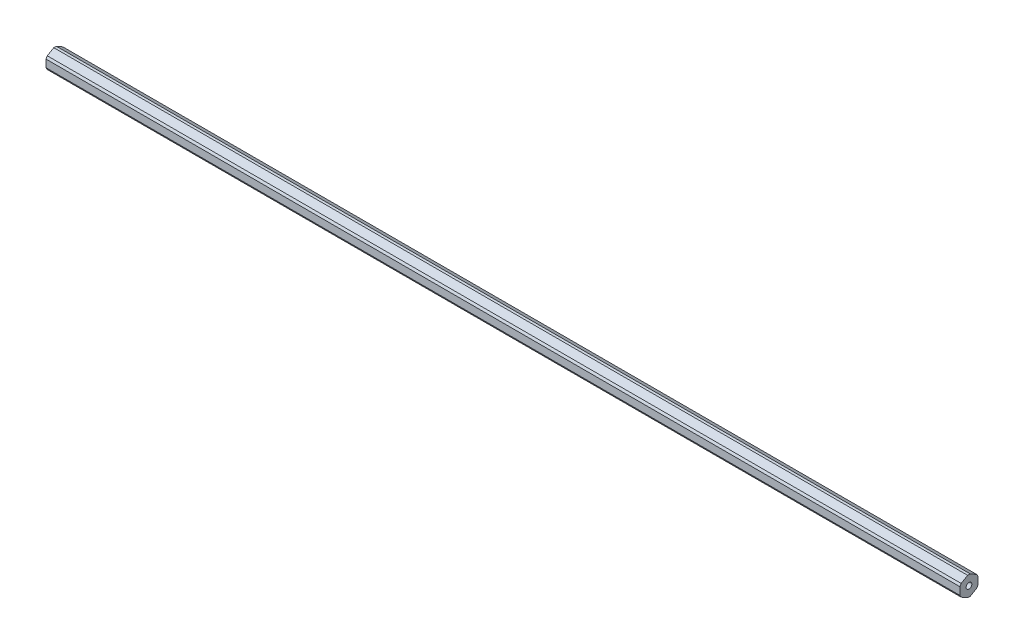
ISO-10303-21;
HEADER;
FILE_DESCRIPTION(('STEP AP214'),'2;1');
FILE_NAME('part.step','',(''),(''),'','','');
FILE_SCHEMA(('AUTOMOTIVE_DESIGN { 1 0 10303 214 1 1 1 1 }'));
ENDSEC;
DATA;
#1=APPLICATION_CONTEXT('core data for automotive mechanical design processes');
#2=APPLICATION_PROTOCOL_DEFINITION('international standard','automotive_design',2000,#1);
#3=PRODUCT_CONTEXT('',#1,'mechanical');
#4=PRODUCT('Part','Part','',(#3));
#5=PRODUCT_RELATED_PRODUCT_CATEGORY('part','',(#4));
#6=PRODUCT_DEFINITION_FORMATION('','',#4);
#7=PRODUCT_DEFINITION_CONTEXT('part definition',#1,'design');
#8=PRODUCT_DEFINITION('design','',#6,#7);
#9=PRODUCT_DEFINITION_SHAPE('','',#8);
#10=(LENGTH_UNIT() NAMED_UNIT(*) SI_UNIT(.MILLI.,.METRE.));
#11=(NAMED_UNIT(*) PLANE_ANGLE_UNIT() SI_UNIT($,.RADIAN.));
#12=(NAMED_UNIT(*) SI_UNIT($,.STERADIAN.) SOLID_ANGLE_UNIT());
#13=UNCERTAINTY_MEASURE_WITH_UNIT(LENGTH_MEASURE(1.E-05),#10,'distance_accuracy_value','');
#14=(GEOMETRIC_REPRESENTATION_CONTEXT(3) GLOBAL_UNCERTAINTY_ASSIGNED_CONTEXT((#13)) GLOBAL_UNIT_ASSIGNED_CONTEXT((#10,
#11,#12)) REPRESENTATION_CONTEXT('',''));
#15=CARTESIAN_POINT('',(0.,0.,0.));
#16=DIRECTION('',(0.,0.,1.));
#17=DIRECTION('',(1.,0.,0.));
#18=AXIS2_PLACEMENT_3D('',#15,#16,#17);
#19=CARTESIAN_POINT('',(320.675,60.3334399223982,544.710452363446));
#20=DIRECTION('',(0.,-0.866025403784439,-0.5));
#21=DIRECTION('',(0.,0.5,-0.866025403784439));
#22=AXIS2_PLACEMENT_3D('',#19,#20,#21);
#23=PLANE('',#22);
#24=DIRECTION('',(-1.,0.,0.));
#25=VECTOR('',#24,1.);
#26=CARTESIAN_POINT('',(320.675,61.6502711795929,542.42963372099));
#27=LINE('',#26,#25);
#28=CARTESIAN_POINT('',(320.675,61.6502711795929,542.42963372099));
#29=VERTEX_POINT('',#28);
#30=CARTESIAN_POINT('',(-320.675,61.6502711795931,542.42963372099));
#31=VERTEX_POINT('',#30);
#32=EDGE_CURVE('E183',#29,#31,#27,.T.);
#33=ORIENTED_EDGE('',*,*,#32,.T.);
#34=DIRECTION('',(0.,0.5,-0.866025403784438));
#35=VECTOR('',#34,1.);
#36=CARTESIAN_POINT('',(-320.675,60.3334399223984,544.710452363446));
#37=LINE('',#36,#35);
#38=CARTESIAN_POINT('',(-320.675,59.0166086652037,546.991271005902));
#39=VERTEX_POINT('',#38);
#40=EDGE_CURVE('E142',#39,#31,#37,.T.);
#41=ORIENTED_EDGE('',*,*,#40,.F.);
#42=DIRECTION('',(-1.,0.,0.));
#43=VECTOR('',#42,1.);
#44=CARTESIAN_POINT('',(320.675,59.0166086652036,546.991271005902));
#45=LINE('',#44,#43);
#46=CARTESIAN_POINT('',(320.675,59.0166086652036,546.991271005902));
#47=VERTEX_POINT('',#46);
#48=EDGE_CURVE('E186',#39,#47,#45,.F.);
#49=ORIENTED_EDGE('',*,*,#48,.T.);
#50=DIRECTION('',(0.,-0.5,0.866025403784439));
#51=VECTOR('',#50,1.);
#52=CARTESIAN_POINT('',(320.675,60.3334399223982,544.710452363446));
#53=LINE('',#52,#51);
#54=EDGE_CURVE('E194',#29,#47,#53,.T.);
#55=ORIENTED_EDGE('',*,*,#54,.F.);
#56=EDGE_LOOP('',(#33,#41,#49,#55));
#57=FACE_BOUND('',#56,.T.);
#58=ADVANCED_FACE('F17',(#57),#23,.F.);
#59=CARTESIAN_POINT('',(320.675,54.8337049223982,547.885725846167));
#60=DIRECTION('',(0.,0.,-1.));
#61=DIRECTION('',(-1.,0.,0.));
#62=AXIS2_PLACEMENT_3D('',#59,#60,#61);
#63=PLANE('',#62);
#64=DIRECTION('',(-1.,0.,0.));
#65=VECTOR('',#64,1.);
#66=CARTESIAN_POINT('',(320.675,57.4673674367876,547.885725846167));
#67=LINE('',#66,#65);
#68=CARTESIAN_POINT('',(320.675,57.4673674367876,547.885725846167));
#69=VERTEX_POINT('',#68);
#70=CARTESIAN_POINT('',(-320.675,57.4673674367878,547.885725846167));
#71=VERTEX_POINT('',#70);
#72=EDGE_CURVE('E118',#69,#71,#67,.T.);
#73=ORIENTED_EDGE('',*,*,#72,.T.);
#74=DIRECTION('',(0.,1.,0.));
#75=VECTOR('',#74,1.);
#76=CARTESIAN_POINT('',(-320.675,54.8337049223984,547.885725846167));
#77=LINE('',#76,#75);
#78=CARTESIAN_POINT('',(-320.675,52.200042408009,547.885725846167));
#79=VERTEX_POINT('',#78);
#80=EDGE_CURVE('E136',#79,#71,#77,.T.);
#81=ORIENTED_EDGE('',*,*,#80,.F.);
#82=DIRECTION('',(-1.,0.,0.));
#83=VECTOR('',#82,1.);
#84=CARTESIAN_POINT('',(320.675,52.2000424080089,547.885725846167));
#85=LINE('',#84,#83);
#86=CARTESIAN_POINT('',(320.675,52.2000424080089,547.885725846167));
#87=VERTEX_POINT('',#86);
#88=EDGE_CURVE('E179',#79,#87,#85,.F.);
#89=ORIENTED_EDGE('',*,*,#88,.T.);
#90=DIRECTION('',(0.,-1.,0.));
#91=VECTOR('',#90,1.);
#92=CARTESIAN_POINT('',(320.675,54.8337049223982,547.885725846167));
#93=LINE('',#92,#91);
#94=EDGE_CURVE('E198',#69,#87,#93,.T.);
#95=ORIENTED_EDGE('',*,*,#94,.F.);
#96=EDGE_LOOP('',(#73,#81,#89,#95));
#97=FACE_BOUND('',#96,.T.);
#98=ADVANCED_FACE('F253',(#97),#63,.F.);
#99=CARTESIAN_POINT('',(320.675,49.3339699223982,544.710452363446));
#100=DIRECTION('',(0.,0.866025403784438,-0.5));
#101=DIRECTION('',(0.,0.5,0.866025403784438));
#102=AXIS2_PLACEMENT_3D('',#99,#100,#101);
#103=PLANE('',#102);
#104=DIRECTION('',(-1.,0.,0.));
#105=VECTOR('',#104,1.);
#106=CARTESIAN_POINT('',(320.675,50.6508011795929,546.991271005902));
#107=LINE('',#106,#105);
#108=CARTESIAN_POINT('',(320.675,50.6508011795929,546.991271005902));
#109=VERTEX_POINT('',#108);
#110=CARTESIAN_POINT('',(-320.675,50.6508011795931,546.991271005902));
#111=VERTEX_POINT('',#110);
#112=EDGE_CURVE('E119',#109,#111,#107,.T.);
#113=ORIENTED_EDGE('',*,*,#112,.T.);
#114=DIRECTION('',(0.,0.5,0.866025403784439));
#115=VECTOR('',#114,1.);
#116=CARTESIAN_POINT('',(-320.675,49.3339699223984,544.710452363446));
#117=LINE('',#116,#115);
#118=CARTESIAN_POINT('',(-320.675,48.0171386652037,542.42963372099));
#119=VERTEX_POINT('',#118);
#120=EDGE_CURVE('E125',#119,#111,#117,.T.);
#121=ORIENTED_EDGE('',*,*,#120,.F.);
#122=DIRECTION('',(-1.,0.,0.));
#123=VECTOR('',#122,1.);
#124=CARTESIAN_POINT('',(320.675,48.0171386652035,542.42963372099));
#125=LINE('',#124,#123);
#126=CARTESIAN_POINT('',(320.675,48.0171386652035,542.42963372099));
#127=VERTEX_POINT('',#126);
#128=EDGE_CURVE('E106',#119,#127,#125,.F.);
#129=ORIENTED_EDGE('',*,*,#128,.T.);
#130=DIRECTION('',(0.,-0.5,-0.866025403784438));
#131=VECTOR('',#130,1.);
#132=CARTESIAN_POINT('',(320.675,49.3339699223982,544.710452363446));
#133=LINE('',#132,#131);
#134=EDGE_CURVE('E202',#109,#127,#133,.T.);
#135=ORIENTED_EDGE('',*,*,#134,.F.);
#136=EDGE_LOOP('',(#113,#121,#129,#135));
#137=FACE_BOUND('',#136,.T.);
#138=ADVANCED_FACE('F133',(#137),#103,.F.);
#139=CARTESIAN_POINT('',(320.675,49.3339699223982,538.359905398003));
#140=DIRECTION('',(0.,0.866025403784439,0.5));
#141=DIRECTION('',(0.,-0.5,0.866025403784439));
#142=AXIS2_PLACEMENT_3D('',#139,#140,#141);
#143=PLANE('',#142);
#144=DIRECTION('',(-1.,0.,0.));
#145=VECTOR('',#144,1.);
#146=CARTESIAN_POINT('',(320.675,48.0171386652035,540.640724040459));
#147=LINE('',#146,#145);
#148=CARTESIAN_POINT('',(320.675,48.0171386652035,540.640724040459));
#149=VERTEX_POINT('',#148);
#150=CARTESIAN_POINT('',(-320.675,48.0171386652037,540.640724040459));
#151=VERTEX_POINT('',#150);
#152=EDGE_CURVE('E168',#149,#151,#147,.T.);
#153=ORIENTED_EDGE('',*,*,#152,.T.);
#154=DIRECTION('',(0.,-0.5,0.866025403784438));
#155=VECTOR('',#154,1.);
#156=CARTESIAN_POINT('',(-320.675,49.3339699223984,538.359905398003));
#157=LINE('',#156,#155);
#158=CARTESIAN_POINT('',(-320.675,50.6508011795931,536.079086755547));
#159=VERTEX_POINT('',#158);
#160=EDGE_CURVE('E128',#159,#151,#157,.T.);
#161=ORIENTED_EDGE('',*,*,#160,.F.);
#162=DIRECTION('',(-1.,0.,0.));
#163=VECTOR('',#162,1.);
#164=CARTESIAN_POINT('',(320.675,50.6508011795929,536.079086755547));
#165=LINE('',#164,#163);
#166=CARTESIAN_POINT('',(320.675,50.6508011795929,536.079086755547));
#167=VERTEX_POINT('',#166);
#168=EDGE_CURVE('E171',#159,#167,#165,.F.);
#169=ORIENTED_EDGE('',*,*,#168,.T.);
#170=DIRECTION('',(0.,0.5,-0.866025403784439));
#171=VECTOR('',#170,1.);
#172=CARTESIAN_POINT('',(320.675,49.3339699223982,538.359905398003));
#173=LINE('',#172,#171);
#174=EDGE_CURVE('E205',#149,#167,#173,.T.);
#175=ORIENTED_EDGE('',*,*,#174,.F.);
#176=EDGE_LOOP('',(#153,#161,#169,#175));
#177=FACE_BOUND('',#176,.T.);
#178=ADVANCED_FACE('F282',(#177),#143,.F.);
#179=CARTESIAN_POINT('',(320.675,54.8337049223982,535.184631915281));
#180=DIRECTION('',(0.,0.,1.));
#181=DIRECTION('',(1.,0.,0.));
#182=AXIS2_PLACEMENT_3D('',#179,#180,#181);
#183=PLANE('',#182);
#184=DIRECTION('',(-1.,0.,0.));
#185=VECTOR('',#184,1.);
#186=CARTESIAN_POINT('',(320.675,52.2000424080089,535.184631915281));
#187=LINE('',#186,#185);
#188=CARTESIAN_POINT('',(320.675,52.2000424080089,535.184631915281));
#189=VERTEX_POINT('',#188);
#190=CARTESIAN_POINT('',(-320.675,52.200042408009,535.184631915281));
#191=VERTEX_POINT('',#190);
#192=EDGE_CURVE('E161',#189,#191,#187,.T.);
#193=ORIENTED_EDGE('',*,*,#192,.T.);
#194=DIRECTION('',(0.,-1.,0.));
#195=VECTOR('',#194,1.);
#196=CARTESIAN_POINT('',(-320.675,54.8337049223984,535.184631915281));
#197=LINE('',#196,#195);
#198=CARTESIAN_POINT('',(-320.675,57.4673674367878,535.184631915281));
#199=VERTEX_POINT('',#198);
#200=EDGE_CURVE('E145',#199,#191,#197,.T.);
#201=ORIENTED_EDGE('',*,*,#200,.F.);
#202=DIRECTION('',(-1.,0.,0.));
#203=VECTOR('',#202,1.);
#204=CARTESIAN_POINT('',(320.675,57.4673674367876,535.184631915281));
#205=LINE('',#204,#203);
#206=CARTESIAN_POINT('',(320.675,57.4673674367876,535.184631915281));
#207=VERTEX_POINT('',#206);
#208=EDGE_CURVE('E164',#199,#207,#205,.F.);
#209=ORIENTED_EDGE('',*,*,#208,.T.);
#210=DIRECTION('',(0.,1.,0.));
#211=VECTOR('',#210,1.);
#212=CARTESIAN_POINT('',(320.675,54.8337049223982,535.184631915281));
#213=LINE('',#212,#211);
#214=EDGE_CURVE('E25',#189,#207,#213,.T.);
#215=ORIENTED_EDGE('',*,*,#214,.F.);
#216=EDGE_LOOP('',(#193,#201,#209,#215));
#217=FACE_BOUND('',#216,.T.);
#218=ADVANCED_FACE('F217',(#217),#183,.F.);
#219=CARTESIAN_POINT('',(320.675,60.3334399223982,538.359905398003));
#220=DIRECTION('',(0.,-0.866025403784438,0.5));
#221=DIRECTION('',(0.,-0.5,-0.866025403784438));
#222=AXIS2_PLACEMENT_3D('',#219,#220,#221);
#223=PLANE('',#222);
#224=DIRECTION('',(-1.,0.,0.));
#225=VECTOR('',#224,1.);
#226=CARTESIAN_POINT('',(320.675,59.0166086652035,536.079086755547));
#227=LINE('',#226,#225);
#228=CARTESIAN_POINT('',(320.675,59.0166086652036,536.079086755547));
#229=VERTEX_POINT('',#228);
#230=CARTESIAN_POINT('',(-320.675,59.0166086652037,536.079086755547));
#231=VERTEX_POINT('',#230);
#232=EDGE_CURVE('E40',#229,#231,#227,.T.);
#233=ORIENTED_EDGE('',*,*,#232,.T.);
#234=DIRECTION('',(0.,-0.5,-0.866025403784439));
#235=VECTOR('',#234,1.);
#236=CARTESIAN_POINT('',(-320.675,60.3334399223984,538.359905398003));
#237=LINE('',#236,#235);
#238=CARTESIAN_POINT('',(-320.675,61.6502711795931,540.640724040459));
#239=VERTEX_POINT('',#238);
#240=EDGE_CURVE('E227',#239,#231,#237,.T.);
#241=ORIENTED_EDGE('',*,*,#240,.F.);
#242=DIRECTION('',(-1.,0.,0.));
#243=VECTOR('',#242,1.);
#244=CARTESIAN_POINT('',(320.675,61.6502711795929,540.640724040459));
#245=LINE('',#244,#243);
#246=CARTESIAN_POINT('',(320.675,61.6502711795929,540.640724040459));
#247=VERTEX_POINT('',#246);
#248=EDGE_CURVE('E158',#239,#247,#245,.F.);
#249=ORIENTED_EDGE('',*,*,#248,.T.);
#250=DIRECTION('',(0.,0.5,0.866025403784438));
#251=VECTOR('',#250,1.);
#252=CARTESIAN_POINT('',(320.675,60.3334399223982,538.359905398003));
#253=LINE('',#252,#251);
#254=EDGE_CURVE('E11',#229,#247,#253,.T.);
#255=ORIENTED_EDGE('',*,*,#254,.F.);
#256=EDGE_LOOP('',(#233,#241,#249,#255));
#257=FACE_BOUND('',#256,.T.);
#258=ADVANCED_FACE('F260',(#257),#223,.F.);
#259=CARTESIAN_POINT('',(320.675,54.8337049223982,541.535178880724));
#260=DIRECTION('',(1.,0.,0.));
#261=DIRECTION('',(0.,1.,0.));
#262=AXIS2_PLACEMENT_3D('',#259,#260,#261);
#263=PLANE('',#262);
#264=CARTESIAN_POINT('',(320.675,54.8337049223982,541.535178880724));
#265=DIRECTION('',(1.,0.,0.));
#266=DIRECTION('',(0.,1.,0.));
#267=AXIS2_PLACEMENT_3D('',#264,#265,#266);
#268=CIRCLE('',#267,2.);
#269=CARTESIAN_POINT('',(320.675,56.8337049223982,541.535178880724));
#270=VERTEX_POINT('',#269);
#271=EDGE_CURVE('E190',#270,#270,#268,.T.);
#272=ORIENTED_EDGE('',*,*,#271,.F.);
#273=EDGE_LOOP('',(#272));
#274=FACE_BOUND('',#273,.T.);
#275=ORIENTED_EDGE('',*,*,#54,.T.);
#276=CARTESIAN_POINT('',(320.675,54.8337049223982,541.535178880724));
#277=DIRECTION('',(1.,0.,0.));
#278=DIRECTION('',(0.,1.,0.));
#279=AXIS2_PLACEMENT_3D('',#276,#277,#278);
#280=CIRCLE('',#279,6.875);
#281=EDGE_CURVE('E155',#47,#69,#280,.T.);
#282=ORIENTED_EDGE('',*,*,#281,.T.);
#283=ORIENTED_EDGE('',*,*,#94,.T.);
#284=EDGE_CURVE('E244',#87,#109,#280,.T.);
#285=ORIENTED_EDGE('',*,*,#284,.T.);
#286=ORIENTED_EDGE('',*,*,#134,.T.);
#287=EDGE_CURVE('E112',#127,#149,#280,.T.);
#288=ORIENTED_EDGE('',*,*,#287,.T.);
#289=ORIENTED_EDGE('',*,*,#174,.T.);
#290=EDGE_CURVE('E215',#167,#189,#280,.T.);
#291=ORIENTED_EDGE('',*,*,#290,.T.);
#292=ORIENTED_EDGE('',*,*,#214,.T.);
#293=EDGE_CURVE('E154',#207,#229,#280,.T.);
#294=ORIENTED_EDGE('',*,*,#293,.T.);
#295=ORIENTED_EDGE('',*,*,#254,.T.);
#296=EDGE_CURVE('E32',#247,#29,#280,.T.);
#297=ORIENTED_EDGE('',*,*,#296,.T.);
#298=EDGE_LOOP('',(#275,#282,#283,#285,#286,#288,#289,#291,#292,#294,#295,#297));
#299=FACE_BOUND('',#298,.T.);
#300=ADVANCED_FACE('F213',(#274,#299),#263,.T.);
#301=CARTESIAN_POINT('',(320.675,54.8337049223982,541.535178880724));
#302=DIRECTION('',(-1.,0.,0.));
#303=DIRECTION('',(0.,-1.,0.));
#304=AXIS2_PLACEMENT_3D('',#301,#302,#303);
#305=CYLINDRICAL_SURFACE('',#304,2.);
#306=ORIENTED_EDGE('',*,*,#271,.T.);
#307=EDGE_LOOP('',(#306));
#308=FACE_BOUND('',#307,.T.);
#309=CARTESIAN_POINT('',(-320.675,54.8337049223984,541.535178880724));
#310=DIRECTION('',(-1.,0.,0.));
#311=DIRECTION('',(0.,-1.,0.));
#312=AXIS2_PLACEMENT_3D('',#309,#310,#311);
#313=CIRCLE('',#312,2.);
#314=CARTESIAN_POINT('',(-320.675,52.8337049223984,541.535178880724));
#315=VERTEX_POINT('',#314);
#316=EDGE_CURVE('E233',#315,#315,#313,.T.);
#317=ORIENTED_EDGE('',*,*,#316,.T.);
#318=EDGE_LOOP('',(#317));
#319=FACE_BOUND('',#318,.T.);
#320=ADVANCED_FACE('F272',(#308,#319),#305,.F.);
#321=CARTESIAN_POINT('',(320.675,54.8337049223982,541.535178880724));
#322=DIRECTION('',(-1.,0.,0.));
#323=DIRECTION('',(0.,-1.,0.));
#324=AXIS2_PLACEMENT_3D('',#321,#322,#323);
#325=CYLINDRICAL_SURFACE('',#324,6.875);
#326=ORIENTED_EDGE('',*,*,#208,.F.);
#327=CARTESIAN_POINT('',(-320.675,54.8337049223984,541.535178880724));
#328=DIRECTION('',(-1.,0.,0.));
#329=DIRECTION('',(0.,-1.,0.));
#330=AXIS2_PLACEMENT_3D('',#327,#328,#329);
#331=CIRCLE('',#330,6.875);
#332=EDGE_CURVE('E223',#231,#199,#331,.T.);
#333=ORIENTED_EDGE('',*,*,#332,.F.);
#334=ORIENTED_EDGE('',*,*,#232,.F.);
#335=ORIENTED_EDGE('',*,*,#293,.F.);
#336=EDGE_LOOP('',(#326,#333,#334,#335));
#337=FACE_BOUND('',#336,.T.);
#338=ADVANCED_FACE('F222',(#337),#325,.T.);
#339=ORIENTED_EDGE('',*,*,#296,.F.);
#340=ORIENTED_EDGE('',*,*,#248,.F.);
#341=EDGE_CURVE('E228',#31,#239,#331,.T.);
#342=ORIENTED_EDGE('',*,*,#341,.F.);
#343=ORIENTED_EDGE('',*,*,#32,.F.);
#344=EDGE_LOOP('',(#339,#340,#342,#343));
#345=FACE_BOUND('',#344,.T.);
#346=ADVANCED_FACE('F262',(#345),#325,.T.);
#347=ORIENTED_EDGE('',*,*,#168,.F.);
#348=EDGE_CURVE('E130',#191,#159,#331,.T.);
#349=ORIENTED_EDGE('',*,*,#348,.F.);
#350=ORIENTED_EDGE('',*,*,#192,.F.);
#351=ORIENTED_EDGE('',*,*,#290,.F.);
#352=EDGE_LOOP('',(#347,#349,#350,#351));
#353=FACE_BOUND('',#352,.T.);
#354=ADVANCED_FACE('F264',(#353),#325,.T.);
#355=ORIENTED_EDGE('',*,*,#128,.F.);
#356=EDGE_CURVE('E109',#151,#119,#331,.T.);
#357=ORIENTED_EDGE('',*,*,#356,.F.);
#358=ORIENTED_EDGE('',*,*,#152,.F.);
#359=ORIENTED_EDGE('',*,*,#287,.F.);
#360=EDGE_LOOP('',(#355,#357,#358,#359));
#361=FACE_BOUND('',#360,.T.);
#362=ADVANCED_FACE('F108',(#361),#325,.T.);
#363=ORIENTED_EDGE('',*,*,#88,.F.);
#364=EDGE_CURVE('E132',#111,#79,#331,.T.);
#365=ORIENTED_EDGE('',*,*,#364,.F.);
#366=ORIENTED_EDGE('',*,*,#112,.F.);
#367=ORIENTED_EDGE('',*,*,#284,.F.);
#368=EDGE_LOOP('',(#363,#365,#366,#367));
#369=FACE_BOUND('',#368,.T.);
#370=ADVANCED_FACE('F266',(#369),#325,.T.);
#371=ORIENTED_EDGE('',*,*,#48,.F.);
#372=EDGE_CURVE('E230',#71,#39,#331,.T.);
#373=ORIENTED_EDGE('',*,*,#372,.F.);
#374=ORIENTED_EDGE('',*,*,#72,.F.);
#375=ORIENTED_EDGE('',*,*,#281,.F.);
#376=EDGE_LOOP('',(#371,#373,#374,#375));
#377=FACE_BOUND('',#376,.T.);
#378=ADVANCED_FACE('F256',(#377),#325,.T.);
#379=CARTESIAN_POINT('',(-320.675,54.8337049223984,541.535178880724));
#380=DIRECTION('',(-1.,0.,0.));
#381=DIRECTION('',(0.,1.,0.));
#382=AXIS2_PLACEMENT_3D('',#379,#380,#381);
#383=PLANE('',#382);
#384=ORIENTED_EDGE('',*,*,#316,.F.);
#385=EDGE_LOOP('',(#384));
#386=FACE_BOUND('',#385,.T.);
#387=ORIENTED_EDGE('',*,*,#120,.T.);
#388=ORIENTED_EDGE('',*,*,#364,.T.);
#389=ORIENTED_EDGE('',*,*,#80,.T.);
#390=ORIENTED_EDGE('',*,*,#372,.T.);
#391=ORIENTED_EDGE('',*,*,#40,.T.);
#392=ORIENTED_EDGE('',*,*,#341,.T.);
#393=ORIENTED_EDGE('',*,*,#240,.T.);
#394=ORIENTED_EDGE('',*,*,#332,.T.);
#395=ORIENTED_EDGE('',*,*,#200,.T.);
#396=ORIENTED_EDGE('',*,*,#348,.T.);
#397=ORIENTED_EDGE('',*,*,#160,.T.);
#398=ORIENTED_EDGE('',*,*,#356,.T.);
#399=EDGE_LOOP('',(#387,#388,#389,#390,#391,#392,#393,#394,#395,#396,#397,#398));
#400=FACE_BOUND('',#399,.T.);
#401=ADVANCED_FACE('F123',(#386,#400),#383,.T.);
#402=CLOSED_SHELL('',(#58,#98,#138,#178,#218,#258,#300,#320,#338,#346,#354,#362,#370,#378,#401));
#403=MANIFOLD_SOLID_BREP('B1',#402);
#404=ADVANCED_BREP_SHAPE_REPRESENTATION('',(#18,#403),#14);
#405=SHAPE_DEFINITION_REPRESENTATION(#9,#404);
ENDSEC;
END-ISO-10303-21;
